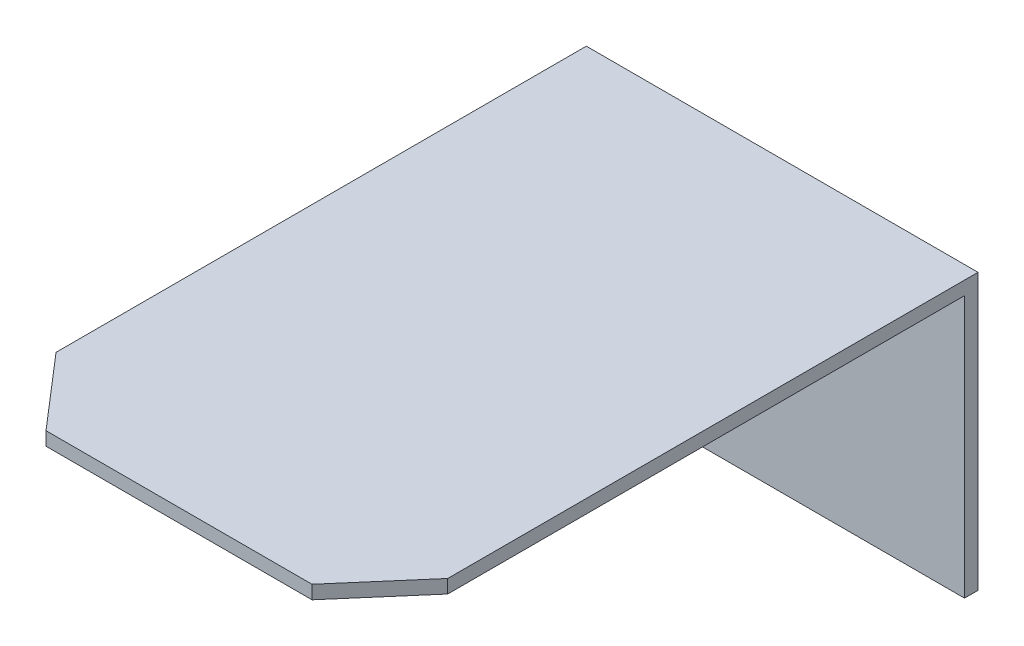
ISO-10303-21;
HEADER;
FILE_DESCRIPTION(('STEP AP214'),'2;1');
FILE_NAME('part.step','',(''),(''),'','','');
FILE_SCHEMA(('AUTOMOTIVE_DESIGN { 1 0 10303 214 1 1 1 1 }'));
ENDSEC;
DATA;
#1=APPLICATION_CONTEXT('core data for automotive mechanical design processes');
#2=APPLICATION_PROTOCOL_DEFINITION('international standard','automotive_design',2000,#1);
#3=PRODUCT_CONTEXT('',#1,'mechanical');
#4=PRODUCT('Part','Part','',(#3));
#5=PRODUCT_RELATED_PRODUCT_CATEGORY('part','',(#4));
#6=PRODUCT_DEFINITION_FORMATION('','',#4);
#7=PRODUCT_DEFINITION_CONTEXT('part definition',#1,'design');
#8=PRODUCT_DEFINITION('design','',#6,#7);
#9=PRODUCT_DEFINITION_SHAPE('','',#8);
#10=(LENGTH_UNIT() NAMED_UNIT(*) SI_UNIT(.MILLI.,.METRE.));
#11=(NAMED_UNIT(*) PLANE_ANGLE_UNIT() SI_UNIT($,.RADIAN.));
#12=(NAMED_UNIT(*) SI_UNIT($,.STERADIAN.) SOLID_ANGLE_UNIT());
#13=UNCERTAINTY_MEASURE_WITH_UNIT(LENGTH_MEASURE(1.E-05),#10,'distance_accuracy_value','');
#14=(GEOMETRIC_REPRESENTATION_CONTEXT(3) GLOBAL_UNCERTAINTY_ASSIGNED_CONTEXT((#13)) GLOBAL_UNIT_ASSIGNED_CONTEXT((#10,
#11,#12)) REPRESENTATION_CONTEXT('',''));
#15=CARTESIAN_POINT('',(0.,0.,0.));
#16=DIRECTION('',(0.,0.,1.));
#17=DIRECTION('',(1.,0.,0.));
#18=AXIS2_PLACEMENT_3D('',#15,#16,#17);
#19=CARTESIAN_POINT('',(0.,1.1938,0.));
#20=DIRECTION('',(1.,0.,0.));
#21=DIRECTION('',(0.,0.,-1.));
#22=AXIS2_PLACEMENT_3D('',#19,#20,#21);
#23=PLANE('',#22);
#24=DIRECTION('',(0.,1.,0.));
#25=VECTOR('',#24,1.);
#26=CARTESIAN_POINT('',(0.,-23.190225,-6.45159999999999));
#27=LINE('',#26,#25);
#28=CARTESIAN_POINT('',(0.,0.,-6.45159999999999));
#29=VERTEX_POINT('',#28);
#30=CARTESIAN_POINT('',(0.,1.1938,-6.45159999999999));
#31=VERTEX_POINT('',#30);
#32=EDGE_CURVE('E53',#29,#31,#27,.T.);
#33=ORIENTED_EDGE('',*,*,#32,.T.);
#34=DIRECTION('',(0.,0.,1.));
#35=VECTOR('',#34,1.);
#36=CARTESIAN_POINT('',(0.,1.1938,0.));
#37=LINE('',#36,#35);
#38=CARTESIAN_POINT('',(0.,1.1938,-53.3908));
#39=VERTEX_POINT('',#38);
#40=EDGE_CURVE('E117',#39,#31,#37,.T.);
#41=ORIENTED_EDGE('',*,*,#40,.F.);
#42=DIRECTION('',(0.,1.,0.));
#43=VECTOR('',#42,1.);
#44=CARTESIAN_POINT('',(0.,1.1938,-53.3908));
#45=LINE('',#44,#43);
#46=CARTESIAN_POINT('',(0.,-23.1902,-53.3908));
#47=VERTEX_POINT('',#46);
#48=EDGE_CURVE('E169',#47,#39,#45,.T.);
#49=ORIENTED_EDGE('',*,*,#48,.F.);
#50=DIRECTION('',(0.,0.,1.));
#51=VECTOR('',#50,1.);
#52=CARTESIAN_POINT('',(0.,-23.1902,-53.3908));
#53=LINE('',#52,#51);
#54=CARTESIAN_POINT('',(0.,-23.1902,-52.197));
#55=VERTEX_POINT('',#54);
#56=EDGE_CURVE('E164',#47,#55,#53,.T.);
#57=ORIENTED_EDGE('',*,*,#56,.T.);
#58=DIRECTION('',(0.,1.,0.));
#59=VECTOR('',#58,1.);
#60=CARTESIAN_POINT('',(0.,1.1938,-52.197));
#61=LINE('',#60,#59);
#62=CARTESIAN_POINT('',(0.,0.,-52.197));
#63=VERTEX_POINT('',#62);
#64=EDGE_CURVE('E149',#55,#63,#61,.T.);
#65=ORIENTED_EDGE('',*,*,#64,.T.);
#66=DIRECTION('',(0.,0.,1.));
#67=VECTOR('',#66,1.);
#68=CARTESIAN_POINT('',(0.,0.,0.));
#69=LINE('',#68,#67);
#70=EDGE_CURVE('E125',#63,#29,#69,.T.);
#71=ORIENTED_EDGE('',*,*,#70,.T.);
#72=EDGE_LOOP('',(#33,#41,#49,#57,#65,#71));
#73=FACE_BOUND('',#72,.T.);
#74=ADVANCED_FACE('F32',(#73),#23,.F.);
#75=CARTESIAN_POINT('',(0.,1.1938,0.));
#76=DIRECTION('',(0.,0.,-1.));
#77=DIRECTION('',(-1.,0.,0.));
#78=AXIS2_PLACEMENT_3D('',#75,#76,#77);
#79=PLANE('',#78);
#80=DIRECTION('',(1.,0.,0.));
#81=VECTOR('',#80,1.);
#82=CARTESIAN_POINT('',(0.,0.,0.));
#83=LINE('',#82,#81);
#84=CARTESIAN_POINT('',(5.56259999999999,0.,0.));
#85=VERTEX_POINT('',#84);
#86=CARTESIAN_POINT('',(29.1084,0.,0.));
#87=VERTEX_POINT('',#86);
#88=EDGE_CURVE('E121',#85,#87,#83,.T.);
#89=ORIENTED_EDGE('',*,*,#88,.T.);
#90=DIRECTION('',(0.,1.,0.));
#91=VECTOR('',#90,1.);
#92=CARTESIAN_POINT('',(29.1084,-23.190225,0.));
#93=LINE('',#92,#91);
#94=CARTESIAN_POINT('',(29.1084,1.1938,0.));
#95=VERTEX_POINT('',#94);
#96=EDGE_CURVE('E108',#87,#95,#93,.T.);
#97=ORIENTED_EDGE('',*,*,#96,.T.);
#98=DIRECTION('',(1.,0.,0.));
#99=VECTOR('',#98,1.);
#100=CARTESIAN_POINT('',(0.,1.1938,0.));
#101=LINE('',#100,#99);
#102=CARTESIAN_POINT('',(5.56259999999999,1.1938,0.));
#103=VERTEX_POINT('',#102);
#104=EDGE_CURVE('E107',#103,#95,#101,.T.);
#105=ORIENTED_EDGE('',*,*,#104,.F.);
#106=DIRECTION('',(0.,1.,0.));
#107=VECTOR('',#106,1.);
#108=CARTESIAN_POINT('',(5.56259999999999,-23.190225,0.));
#109=LINE('',#108,#107);
#110=EDGE_CURVE('E151',#85,#103,#109,.T.);
#111=ORIENTED_EDGE('',*,*,#110,.F.);
#112=EDGE_LOOP('',(#89,#97,#105,#111));
#113=FACE_BOUND('',#112,.T.);
#114=ADVANCED_FACE('F181',(#113),#79,.F.);
#115=CARTESIAN_POINT('',(0.,1.1938,0.));
#116=DIRECTION('',(0.,-1.,0.));
#117=DIRECTION('',(0.,0.,-1.));
#118=AXIS2_PLACEMENT_3D('',#115,#116,#117);
#119=PLANE('',#118);
#120=ORIENTED_EDGE('',*,*,#104,.T.);
#121=DIRECTION('',(-0.652998603810393,0.,0.757359111268675));
#122=VECTOR('',#121,1.);
#123=CARTESIAN_POINT('',(16.6963693412876,1.1938,14.3956885265432));
#124=LINE('',#123,#122);
#125=CARTESIAN_POINT('',(34.671,1.1938,-6.4516));
#126=VERTEX_POINT('',#125);
#127=EDGE_CURVE('E94',#126,#95,#124,.T.);
#128=ORIENTED_EDGE('',*,*,#127,.F.);
#129=DIRECTION('',(0.,0.,-1.));
#130=VECTOR('',#129,1.);
#131=CARTESIAN_POINT('',(34.671,1.1938,0.));
#132=LINE('',#131,#130);
#133=CARTESIAN_POINT('',(34.671,1.1938,-53.3908));
#134=VERTEX_POINT('',#133);
#135=EDGE_CURVE('E103',#126,#134,#132,.T.);
#136=ORIENTED_EDGE('',*,*,#135,.T.);
#137=DIRECTION('',(1.,0.,0.));
#138=VECTOR('',#137,1.);
#139=CARTESIAN_POINT('',(34.671,1.1938,-53.3908));
#140=LINE('',#139,#138);
#141=EDGE_CURVE('E161',#39,#134,#140,.T.);
#142=ORIENTED_EDGE('',*,*,#141,.F.);
#143=ORIENTED_EDGE('',*,*,#40,.T.);
#144=DIRECTION('',(0.652998603810393,0.,0.757359111268675));
#145=VECTOR('',#144,1.);
#146=CARTESIAN_POINT('',(3.19066743956542,1.1938,-2.7510085404127));
#147=LINE('',#146,#145);
#148=EDGE_CURVE('E177',#31,#103,#147,.T.);
#149=ORIENTED_EDGE('',*,*,#148,.T.);
#150=EDGE_LOOP('',(#120,#128,#136,#142,#143,#149));
#151=FACE_BOUND('',#150,.T.);
#152=ADVANCED_FACE('F101',(#151),#119,.F.);
#153=CARTESIAN_POINT('',(0.,0.,0.));
#154=DIRECTION('',(0.,-1.,0.));
#155=DIRECTION('',(0.,0.,-1.));
#156=AXIS2_PLACEMENT_3D('',#153,#154,#155);
#157=PLANE('',#156);
#158=DIRECTION('',(0.652998603810393,0.,-0.757359111268675));
#159=VECTOR('',#158,1.);
#160=CARTESIAN_POINT('',(16.6963693412876,0.,14.3956885265432));
#161=LINE('',#160,#159);
#162=CARTESIAN_POINT('',(34.671,0.,-6.4516));
#163=VERTEX_POINT('',#162);
#164=EDGE_CURVE('E46',#87,#163,#161,.T.);
#165=ORIENTED_EDGE('',*,*,#164,.F.);
#166=ORIENTED_EDGE('',*,*,#88,.F.);
#167=DIRECTION('',(-0.652998603810393,0.,-0.757359111268675));
#168=VECTOR('',#167,1.);
#169=CARTESIAN_POINT('',(3.19066743956542,0.,-2.7510085404127));
#170=LINE('',#169,#168);
#171=EDGE_CURVE('E39',#85,#29,#170,.T.);
#172=ORIENTED_EDGE('',*,*,#171,.T.);
#173=ORIENTED_EDGE('',*,*,#70,.F.);
#174=DIRECTION('',(-1.,0.,0.));
#175=VECTOR('',#174,1.);
#176=CARTESIAN_POINT('',(0.,0.,-52.197));
#177=LINE('',#176,#175);
#178=CARTESIAN_POINT('',(34.671,0.,-52.197));
#179=VERTEX_POINT('',#178);
#180=EDGE_CURVE('E130',#179,#63,#177,.T.);
#181=ORIENTED_EDGE('',*,*,#180,.F.);
#182=DIRECTION('',(0.,0.,-1.));
#183=VECTOR('',#182,1.);
#184=CARTESIAN_POINT('',(34.671,0.,0.));
#185=LINE('',#184,#183);
#186=EDGE_CURVE('E124',#163,#179,#185,.T.);
#187=ORIENTED_EDGE('',*,*,#186,.F.);
#188=EDGE_LOOP('',(#165,#166,#172,#173,#181,#187));
#189=FACE_BOUND('',#188,.T.);
#190=ADVANCED_FACE('F140',(#189),#157,.T.);
#191=CARTESIAN_POINT('',(34.671,1.1938,0.));
#192=DIRECTION('',(-1.,0.,0.));
#193=DIRECTION('',(0.,0.,1.));
#194=AXIS2_PLACEMENT_3D('',#191,#192,#193);
#195=PLANE('',#194);
#196=ORIENTED_EDGE('',*,*,#135,.F.);
#197=DIRECTION('',(0.,-1.,0.));
#198=VECTOR('',#197,1.);
#199=CARTESIAN_POINT('',(34.671,1.1938,-6.4516));
#200=LINE('',#199,#198);
#201=EDGE_CURVE('E11',#126,#163,#200,.T.);
#202=ORIENTED_EDGE('',*,*,#201,.T.);
#203=ORIENTED_EDGE('',*,*,#186,.T.);
#204=DIRECTION('',(0.,-1.,0.));
#205=VECTOR('',#204,1.);
#206=CARTESIAN_POINT('',(34.671,1.1938,-52.197));
#207=LINE('',#206,#205);
#208=CARTESIAN_POINT('',(34.671,-23.1902,-52.197));
#209=VERTEX_POINT('',#208);
#210=EDGE_CURVE('E137',#179,#209,#207,.T.);
#211=ORIENTED_EDGE('',*,*,#210,.T.);
#212=DIRECTION('',(0.,0.,1.));
#213=VECTOR('',#212,1.);
#214=CARTESIAN_POINT('',(34.671,-23.1902,-53.3908));
#215=LINE('',#214,#213);
#216=CARTESIAN_POINT('',(34.671,-23.1902,-53.3908));
#217=VERTEX_POINT('',#216);
#218=EDGE_CURVE('E156',#217,#209,#215,.T.);
#219=ORIENTED_EDGE('',*,*,#218,.F.);
#220=DIRECTION('',(0.,-1.,0.));
#221=VECTOR('',#220,1.);
#222=CARTESIAN_POINT('',(34.671,1.1938,-53.3908));
#223=LINE('',#222,#221);
#224=EDGE_CURVE('E114',#134,#217,#223,.T.);
#225=ORIENTED_EDGE('',*,*,#224,.F.);
#226=EDGE_LOOP('',(#196,#202,#203,#211,#219,#225));
#227=FACE_BOUND('',#226,.T.);
#228=ADVANCED_FACE('F111',(#227),#195,.F.);
#229=CARTESIAN_POINT('',(0.,0.,-52.197));
#230=DIRECTION('',(0.,0.,-1.));
#231=DIRECTION('',(-1.,0.,0.));
#232=AXIS2_PLACEMENT_3D('',#229,#230,#231);
#233=PLANE('',#232);
#234=ORIENTED_EDGE('',*,*,#210,.F.);
#235=ORIENTED_EDGE('',*,*,#180,.T.);
#236=ORIENTED_EDGE('',*,*,#64,.F.);
#237=DIRECTION('',(-1.,0.,0.));
#238=VECTOR('',#237,1.);
#239=CARTESIAN_POINT('',(34.671,-23.1902,-52.197));
#240=LINE('',#239,#238);
#241=EDGE_CURVE('E146',#209,#55,#240,.T.);
#242=ORIENTED_EDGE('',*,*,#241,.F.);
#243=EDGE_LOOP('',(#234,#235,#236,#242));
#244=FACE_BOUND('',#243,.T.);
#245=ADVANCED_FACE('F145',(#244),#233,.F.);
#246=CARTESIAN_POINT('',(34.671,-23.1902,-53.3908));
#247=DIRECTION('',(0.,1.,0.));
#248=DIRECTION('',(0.,0.,1.));
#249=AXIS2_PLACEMENT_3D('',#246,#247,#248);
#250=PLANE('',#249);
#251=ORIENTED_EDGE('',*,*,#241,.T.);
#252=ORIENTED_EDGE('',*,*,#56,.F.);
#253=DIRECTION('',(-1.,0.,0.));
#254=VECTOR('',#253,1.);
#255=CARTESIAN_POINT('',(34.671,-23.1902,-53.3908));
#256=LINE('',#255,#254);
#257=EDGE_CURVE('E172',#217,#47,#256,.T.);
#258=ORIENTED_EDGE('',*,*,#257,.F.);
#259=ORIENTED_EDGE('',*,*,#218,.T.);
#260=EDGE_LOOP('',(#251,#252,#258,#259));
#261=FACE_BOUND('',#260,.T.);
#262=ADVANCED_FACE('F194',(#261),#250,.F.);
#263=CARTESIAN_POINT('',(0.,0.,-53.3908));
#264=DIRECTION('',(0.,0.,-1.));
#265=DIRECTION('',(-1.,0.,0.));
#266=AXIS2_PLACEMENT_3D('',#263,#264,#265);
#267=PLANE('',#266);
#268=ORIENTED_EDGE('',*,*,#224,.T.);
#269=ORIENTED_EDGE('',*,*,#257,.T.);
#270=ORIENTED_EDGE('',*,*,#48,.T.);
#271=ORIENTED_EDGE('',*,*,#141,.T.);
#272=EDGE_LOOP('',(#268,#269,#270,#271));
#273=FACE_BOUND('',#272,.T.);
#274=ADVANCED_FACE('F187',(#273),#267,.T.);
#275=CARTESIAN_POINT('',(3.19066743956542,-23.190225,-2.7510085404127));
#276=DIRECTION('',(-0.757359111268675,0.,0.652998603810393));
#277=DIRECTION('',(0.652998603810393,0.,0.757359111268675));
#278=AXIS2_PLACEMENT_3D('',#275,#276,#277);
#279=PLANE('',#278);
#280=ORIENTED_EDGE('',*,*,#110,.T.);
#281=ORIENTED_EDGE('',*,*,#148,.F.);
#282=ORIENTED_EDGE('',*,*,#32,.F.);
#283=ORIENTED_EDGE('',*,*,#171,.F.);
#284=EDGE_LOOP('',(#280,#281,#282,#283));
#285=FACE_BOUND('',#284,.T.);
#286=ADVANCED_FACE('F185',(#285),#279,.T.);
#287=CARTESIAN_POINT('',(16.6963693412876,-23.190225,14.3956885265432));
#288=DIRECTION('',(-0.757359111268675,0.,-0.652998603810393));
#289=DIRECTION('',(-0.652998603810393,0.,0.757359111268675));
#290=AXIS2_PLACEMENT_3D('',#287,#288,#289);
#291=PLANE('',#290);
#292=ORIENTED_EDGE('',*,*,#164,.T.);
#293=ORIENTED_EDGE('',*,*,#201,.F.);
#294=ORIENTED_EDGE('',*,*,#127,.T.);
#295=ORIENTED_EDGE('',*,*,#96,.F.);
#296=EDGE_LOOP('',(#292,#293,#294,#295));
#297=FACE_BOUND('',#296,.T.);
#298=ADVANCED_FACE('F93',(#297),#291,.F.);
#299=CLOSED_SHELL('',(#74,#114,#152,#190,#228,#245,#262,#274,#286,#298));
#300=MANIFOLD_SOLID_BREP('B2',#299);
#301=ADVANCED_BREP_SHAPE_REPRESENTATION('',(#18,#300),#14);
#302=SHAPE_DEFINITION_REPRESENTATION(#9,#301);
ENDSEC;
END-ISO-10303-21;
